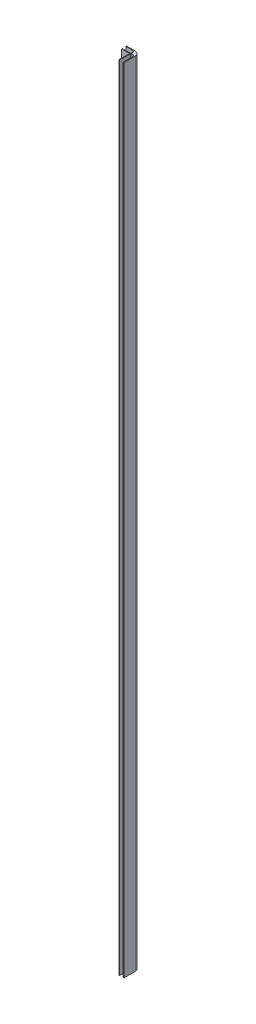
ISO-10303-21;
HEADER;
FILE_DESCRIPTION(('STEP AP214'),'2;1');
FILE_NAME('part.step','',(''),(''),'','','');
FILE_SCHEMA(('AUTOMOTIVE_DESIGN { 1 0 10303 214 1 1 1 1 }'));
ENDSEC;
DATA;
#1=APPLICATION_CONTEXT('core data for automotive mechanical design processes');
#2=APPLICATION_PROTOCOL_DEFINITION('international standard','automotive_design',2000,#1);
#3=PRODUCT_CONTEXT('',#1,'mechanical');
#4=PRODUCT('Part','Part','',(#3));
#5=PRODUCT_RELATED_PRODUCT_CATEGORY('part','',(#4));
#6=PRODUCT_DEFINITION_FORMATION('','',#4);
#7=PRODUCT_DEFINITION_CONTEXT('part definition',#1,'design');
#8=PRODUCT_DEFINITION('design','',#6,#7);
#9=PRODUCT_DEFINITION_SHAPE('','',#8);
#10=(LENGTH_UNIT() NAMED_UNIT(*) SI_UNIT(.MILLI.,.METRE.));
#11=(NAMED_UNIT(*) PLANE_ANGLE_UNIT() SI_UNIT($,.RADIAN.));
#12=(NAMED_UNIT(*) SI_UNIT($,.STERADIAN.) SOLID_ANGLE_UNIT());
#13=UNCERTAINTY_MEASURE_WITH_UNIT(LENGTH_MEASURE(1.E-05),#10,'distance_accuracy_value','');
#14=(GEOMETRIC_REPRESENTATION_CONTEXT(3) GLOBAL_UNCERTAINTY_ASSIGNED_CONTEXT((#13)) GLOBAL_UNIT_ASSIGNED_CONTEXT((#10,
#11,#12)) REPRESENTATION_CONTEXT('',''));
#15=CARTESIAN_POINT('',(0.,0.,0.));
#16=DIRECTION('',(0.,0.,1.));
#17=DIRECTION('',(1.,0.,0.));
#18=AXIS2_PLACEMENT_3D('',#15,#16,#17);
#19=CARTESIAN_POINT('',(5.33700608410615,1200.,-12.0504333475295));
#20=DIRECTION('',(0.,-1.,0.));
#21=DIRECTION('',(0.,0.,-1.));
#22=AXIS2_PLACEMENT_3D('',#19,#20,#21);
#23=CYLINDRICAL_SURFACE('',#22,6.5);
#24=CARTESIAN_POINT('',(5.33700608410615,0.,-12.0504333475295));
#25=DIRECTION('',(0.,1.,0.));
#26=DIRECTION('',(0.,0.,1.));
#27=AXIS2_PLACEMENT_3D('',#24,#25,#26);
#28=CIRCLE('',#27,6.5);
#29=CARTESIAN_POINT('',(11.8370060841062,0.,-12.0504333475295));
#30=VERTEX_POINT('',#29);
#31=CARTESIAN_POINT('',(5.33700608410615,0.,-18.5504333475295));
#32=VERTEX_POINT('',#31);
#33=EDGE_CURVE('E183',#30,#32,#28,.T.);
#34=ORIENTED_EDGE('',*,*,#33,.T.);
#35=DIRECTION('',(0.,-1.,0.));
#36=VECTOR('',#35,1.);
#37=CARTESIAN_POINT('',(5.33700608410615,1200.,-18.5504333475295));
#38=LINE('',#37,#36);
#39=CARTESIAN_POINT('',(5.33700608410615,1200.,-18.5504333475295));
#40=VERTEX_POINT('',#39);
#41=EDGE_CURVE('E164',#40,#32,#38,.T.);
#42=ORIENTED_EDGE('',*,*,#41,.F.);
#43=CARTESIAN_POINT('',(5.33700608410615,1200.,-12.0504333475295));
#44=DIRECTION('',(0.,1.,0.));
#45=DIRECTION('',(0.,0.,1.));
#46=AXIS2_PLACEMENT_3D('',#43,#44,#45);
#47=CIRCLE('',#46,6.5);
#48=CARTESIAN_POINT('',(11.8370060841062,1200.,-12.0504333475295));
#49=VERTEX_POINT('',#48);
#50=EDGE_CURVE('E171',#49,#40,#47,.T.);
#51=ORIENTED_EDGE('',*,*,#50,.F.);
#52=DIRECTION('',(0.,-1.,0.));
#53=VECTOR('',#52,1.);
#54=CARTESIAN_POINT('',(11.8370060841062,1200.,-12.0504333475295));
#55=LINE('',#54,#53);
#56=EDGE_CURVE('E266',#49,#30,#55,.T.);
#57=ORIENTED_EDGE('',*,*,#56,.T.);
#58=EDGE_LOOP('',(#34,#42,#51,#57));
#59=FACE_BOUND('',#58,.T.);
#60=ADVANCED_FACE('F35',(#59),#23,.T.);
#61=CARTESIAN_POINT('',(5.33700608410615,1200.,-18.5504333475295));
#62=DIRECTION('',(0.,0.,1.));
#63=DIRECTION('',(1.,0.,0.));
#64=AXIS2_PLACEMENT_3D('',#61,#62,#63);
#65=PLANE('',#64);
#66=DIRECTION('',(-1.,0.,0.));
#67=VECTOR('',#66,1.);
#68=CARTESIAN_POINT('',(5.33700608410615,0.,-18.5504333475295));
#69=LINE('',#68,#67);
#70=CARTESIAN_POINT('',(-7.8511249428798,0.,-18.5504333475295));
#71=VERTEX_POINT('',#70);
#72=EDGE_CURVE('E295',#32,#71,#69,.T.);
#73=ORIENTED_EDGE('',*,*,#72,.T.);
#74=DIRECTION('',(0.,-1.,0.));
#75=VECTOR('',#74,1.);
#76=CARTESIAN_POINT('',(-7.8511249428798,1200.,-18.5504333475295));
#77=LINE('',#76,#75);
#78=CARTESIAN_POINT('',(-7.8511249428798,1200.,-18.5504333475295));
#79=VERTEX_POINT('',#78);
#80=EDGE_CURVE('E167',#79,#71,#77,.T.);
#81=ORIENTED_EDGE('',*,*,#80,.F.);
#82=DIRECTION('',(-1.,0.,0.));
#83=VECTOR('',#82,1.);
#84=CARTESIAN_POINT('',(5.33700608410615,1200.,-18.5504333475295));
#85=LINE('',#84,#83);
#86=EDGE_CURVE('E160',#40,#79,#85,.T.);
#87=ORIENTED_EDGE('',*,*,#86,.F.);
#88=ORIENTED_EDGE('',*,*,#41,.T.);
#89=EDGE_LOOP('',(#73,#81,#87,#88));
#90=FACE_BOUND('',#89,.T.);
#91=ADVANCED_FACE('F162',(#90),#65,.F.);
#92=CARTESIAN_POINT('',(-7.8511249428798,1200.,-18.5504333475295));
#93=DIRECTION('',(1.,0.,0.));
#94=DIRECTION('',(0.,0.,-1.));
#95=AXIS2_PLACEMENT_3D('',#92,#93,#94);
#96=PLANE('',#95);
#97=DIRECTION('',(0.,0.,1.));
#98=VECTOR('',#97,1.);
#99=CARTESIAN_POINT('',(-7.8511249428798,0.,-18.5504333475295));
#100=LINE('',#99,#98);
#101=CARTESIAN_POINT('',(-7.8511249428798,0.,-17.5504333475295));
#102=VERTEX_POINT('',#101);
#103=EDGE_CURVE('E245',#71,#102,#100,.T.);
#104=ORIENTED_EDGE('',*,*,#103,.T.);
#105=DIRECTION('',(0.,-1.,0.));
#106=VECTOR('',#105,1.);
#107=CARTESIAN_POINT('',(-7.8511249428798,1200.,-17.5504333475295));
#108=LINE('',#107,#106);
#109=CARTESIAN_POINT('',(-7.8511249428798,1200.,-17.5504333475295));
#110=VERTEX_POINT('',#109);
#111=EDGE_CURVE('E189',#110,#102,#108,.T.);
#112=ORIENTED_EDGE('',*,*,#111,.F.);
#113=DIRECTION('',(0.,0.,1.));
#114=VECTOR('',#113,1.);
#115=CARTESIAN_POINT('',(-7.8511249428798,1200.,-18.5504333475295));
#116=LINE('',#115,#114);
#117=EDGE_CURVE('E170',#79,#110,#116,.T.);
#118=ORIENTED_EDGE('',*,*,#117,.F.);
#119=ORIENTED_EDGE('',*,*,#80,.T.);
#120=EDGE_LOOP('',(#104,#112,#118,#119));
#121=FACE_BOUND('',#120,.T.);
#122=ADVANCED_FACE('F318',(#121),#96,.F.);
#123=CARTESIAN_POINT('',(2.33700608410615,1200.,-17.5504333475295));
#124=DIRECTION('',(0.,0.,-1.));
#125=DIRECTION('',(-1.,0.,0.));
#126=AXIS2_PLACEMENT_3D('',#123,#124,#125);
#127=PLANE('',#126);
#128=DIRECTION('',(1.,0.,0.));
#129=VECTOR('',#128,1.);
#130=CARTESIAN_POINT('',(2.33700608410615,0.,-17.5504333475295));
#131=LINE('',#130,#129);
#132=CARTESIAN_POINT('',(2.33700608410615,0.,-17.5504333475295));
#133=VERTEX_POINT('',#132);
#134=EDGE_CURVE('E241',#102,#133,#131,.T.);
#135=ORIENTED_EDGE('',*,*,#134,.T.);
#136=DIRECTION('',(0.,-1.,0.));
#137=VECTOR('',#136,1.);
#138=CARTESIAN_POINT('',(2.33700608410615,1200.,-17.5504333475295));
#139=LINE('',#138,#137);
#140=CARTESIAN_POINT('',(2.33700608410615,1200.,-17.5504333475295));
#141=VERTEX_POINT('',#140);
#142=EDGE_CURVE('E240',#141,#133,#139,.T.);
#143=ORIENTED_EDGE('',*,*,#142,.F.);
#144=DIRECTION('',(1.,0.,0.));
#145=VECTOR('',#144,1.);
#146=CARTESIAN_POINT('',(2.33700608410615,1200.,-17.5504333475295));
#147=LINE('',#146,#145);
#148=EDGE_CURVE('E292',#110,#141,#147,.T.);
#149=ORIENTED_EDGE('',*,*,#148,.F.);
#150=ORIENTED_EDGE('',*,*,#111,.T.);
#151=EDGE_LOOP('',(#135,#143,#149,#150));
#152=FACE_BOUND('',#151,.T.);
#153=ADVANCED_FACE('F291',(#152),#127,.F.);
#154=CARTESIAN_POINT('',(2.33700608410615,1200.,-14.3004333475295));
#155=DIRECTION('',(0.,-1.,0.));
#156=DIRECTION('',(0.,0.,-1.));
#157=AXIS2_PLACEMENT_3D('',#154,#155,#156);
#158=CYLINDRICAL_SURFACE('',#157,3.25);
#159=CARTESIAN_POINT('',(2.33700608410615,0.,-14.3004333475295));
#160=DIRECTION('',(0.,-1.,0.));
#161=DIRECTION('',(0.,0.,1.));
#162=AXIS2_PLACEMENT_3D('',#159,#160,#161);
#163=CIRCLE('',#162,3.25);
#164=CARTESIAN_POINT('',(5.03931419677622,0.,-12.494877791974));
#165=VERTEX_POINT('',#164);
#166=EDGE_CURVE('E233',#133,#165,#163,.T.);
#167=ORIENTED_EDGE('',*,*,#166,.T.);
#168=DIRECTION('',(0.,-1.,0.));
#169=VECTOR('',#168,1.);
#170=CARTESIAN_POINT('',(5.03931419677622,1200.,-12.494877791974));
#171=LINE('',#170,#169);
#172=CARTESIAN_POINT('',(5.03931419677622,1200.,-12.494877791974));
#173=VERTEX_POINT('',#172);
#174=EDGE_CURVE('E197',#165,#173,#171,.F.);
#175=ORIENTED_EDGE('',*,*,#174,.T.);
#176=CARTESIAN_POINT('',(2.33700608410615,1200.,-14.3004333475295));
#177=DIRECTION('',(0.,-1.,0.));
#178=DIRECTION('',(0.,0.,1.));
#179=AXIS2_PLACEMENT_3D('',#176,#177,#178);
#180=CIRCLE('',#179,3.25);
#181=EDGE_CURVE('E216',#141,#173,#180,.T.);
#182=ORIENTED_EDGE('',*,*,#181,.F.);
#183=ORIENTED_EDGE('',*,*,#142,.T.);
#184=EDGE_LOOP('',(#167,#175,#182,#183));
#185=FACE_BOUND('',#184,.T.);
#186=ADVANCED_FACE('F238',(#185),#158,.F.);
#187=CARTESIAN_POINT('',(-7.8511249428798,1200.,-12.0504333475295));
#188=DIRECTION('',(0.,0.,1.));
#189=DIRECTION('',(1.,0.,0.));
#190=AXIS2_PLACEMENT_3D('',#187,#188,#189);
#191=PLANE('',#190);
#192=DIRECTION('',(-1.,0.,0.));
#193=VECTOR('',#192,1.);
#194=CARTESIAN_POINT('',(-7.8511249428798,1200.,-12.0504333475295));
#195=LINE('',#194,#193);
#196=CARTESIAN_POINT('',(4.20783477749313,1200.,-12.0504333475295));
#197=VERTEX_POINT('',#196);
#198=CARTESIAN_POINT('',(-7.8511249428798,1200.,-12.0504333475295));
#199=VERTEX_POINT('',#198);
#200=EDGE_CURVE('E213',#197,#199,#195,.T.);
#201=ORIENTED_EDGE('',*,*,#200,.F.);
#202=DIRECTION('',(0.,1.,0.));
#203=VECTOR('',#202,1.);
#204=CARTESIAN_POINT('',(4.20783477749313,0.,-12.0504333475295));
#205=LINE('',#204,#203);
#206=CARTESIAN_POINT('',(4.20783477749313,0.,-12.0504333475295));
#207=VERTEX_POINT('',#206);
#208=EDGE_CURVE('E194',#197,#207,#205,.F.);
#209=ORIENTED_EDGE('',*,*,#208,.T.);
#210=DIRECTION('',(-1.,0.,0.));
#211=VECTOR('',#210,1.);
#212=CARTESIAN_POINT('',(-7.8511249428798,0.,-12.0504333475295));
#213=LINE('',#212,#211);
#214=CARTESIAN_POINT('',(-7.8511249428798,0.,-12.0504333475295));
#215=VERTEX_POINT('',#214);
#216=EDGE_CURVE('E235',#207,#215,#213,.T.);
#217=ORIENTED_EDGE('',*,*,#216,.T.);
#218=DIRECTION('',(0.,-1.,0.));
#219=VECTOR('',#218,1.);
#220=CARTESIAN_POINT('',(-7.8511249428798,1200.,-12.0504333475295));
#221=LINE('',#220,#219);
#222=EDGE_CURVE('E224',#199,#215,#221,.T.);
#223=ORIENTED_EDGE('',*,*,#222,.F.);
#224=EDGE_LOOP('',(#201,#209,#217,#223));
#225=FACE_BOUND('',#224,.T.);
#226=ADVANCED_FACE('F221',(#225),#191,.F.);
#227=CARTESIAN_POINT('',(-7.8511249428798,1200.,-12.0504333475295));
#228=DIRECTION('',(1.,0.,0.));
#229=DIRECTION('',(0.,0.,-1.));
#230=AXIS2_PLACEMENT_3D('',#227,#228,#229);
#231=PLANE('',#230);
#232=DIRECTION('',(0.,0.,1.));
#233=VECTOR('',#232,1.);
#234=CARTESIAN_POINT('',(-7.8511249428798,0.,-12.0504333475295));
#235=LINE('',#234,#233);
#236=CARTESIAN_POINT('',(-7.8511249428798,0.,-11.0504333475295));
#237=VERTEX_POINT('',#236);
#238=EDGE_CURVE('E243',#215,#237,#235,.T.);
#239=ORIENTED_EDGE('',*,*,#238,.T.);
#240=DIRECTION('',(0.,-1.,0.));
#241=VECTOR('',#240,1.);
#242=CARTESIAN_POINT('',(-7.8511249428798,1200.,-11.0504333475295));
#243=LINE('',#242,#241);
#244=CARTESIAN_POINT('',(-7.8511249428798,1200.,-11.0504333475295));
#245=VERTEX_POINT('',#244);
#246=EDGE_CURVE('E283',#245,#237,#243,.T.);
#247=ORIENTED_EDGE('',*,*,#246,.F.);
#248=DIRECTION('',(0.,0.,1.));
#249=VECTOR('',#248,1.);
#250=CARTESIAN_POINT('',(-7.8511249428798,1200.,-12.0504333475295));
#251=LINE('',#250,#249);
#252=EDGE_CURVE('E226',#199,#245,#251,.T.);
#253=ORIENTED_EDGE('',*,*,#252,.F.);
#254=ORIENTED_EDGE('',*,*,#222,.T.);
#255=EDGE_LOOP('',(#239,#247,#253,#254));
#256=FACE_BOUND('',#255,.T.);
#257=ADVANCED_FACE('F389',(#256),#231,.F.);
#258=CARTESIAN_POINT('',(-7.8511249428798,1200.,-11.0504333475295));
#259=DIRECTION('',(0.,0.,-1.));
#260=DIRECTION('',(-1.,0.,0.));
#261=AXIS2_PLACEMENT_3D('',#258,#259,#260);
#262=PLANE('',#261);
#263=DIRECTION('',(1.,0.,0.));
#264=VECTOR('',#263,1.);
#265=CARTESIAN_POINT('',(-7.8511249428798,0.,-11.0504333475295));
#266=LINE('',#265,#264);
#267=CARTESIAN_POINT('',(3.33700608410615,0.,-11.0504333475295));
#268=VERTEX_POINT('',#267);
#269=EDGE_CURVE('E250',#237,#268,#266,.T.);
#270=ORIENTED_EDGE('',*,*,#269,.T.);
#271=DIRECTION('',(0.,-1.,0.));
#272=VECTOR('',#271,1.);
#273=CARTESIAN_POINT('',(3.33700608410615,1200.,-11.0504333475295));
#274=LINE('',#273,#272);
#275=CARTESIAN_POINT('',(3.33700608410615,1200.,-11.0504333475295));
#276=VERTEX_POINT('',#275);
#277=EDGE_CURVE('E187',#268,#276,#274,.F.);
#278=ORIENTED_EDGE('',*,*,#277,.T.);
#279=DIRECTION('',(1.,0.,0.));
#280=VECTOR('',#279,1.);
#281=CARTESIAN_POINT('',(-7.8511249428798,1200.,-11.0504333475295));
#282=LINE('',#281,#280);
#283=EDGE_CURVE('E312',#245,#276,#282,.T.);
#284=ORIENTED_EDGE('',*,*,#283,.F.);
#285=ORIENTED_EDGE('',*,*,#246,.T.);
#286=EDGE_LOOP('',(#270,#278,#284,#285));
#287=FACE_BOUND('',#286,.T.);
#288=ADVANCED_FACE('F385',(#287),#262,.F.);
#289=CARTESIAN_POINT('',(4.33700608410615,1200.,-11.0504333475295));
#290=DIRECTION('',(1.,0.,0.));
#291=DIRECTION('',(0.,0.,-1.));
#292=AXIS2_PLACEMENT_3D('',#289,#290,#291);
#293=PLANE('',#292);
#294=DIRECTION('',(0.,0.,1.));
#295=VECTOR('',#294,1.);
#296=CARTESIAN_POINT('',(4.33700608410615,1200.,-11.0504333475295));
#297=LINE('',#296,#295);
#298=CARTESIAN_POINT('',(4.33700608410615,1200.,-10.0504333475295));
#299=VERTEX_POINT('',#298);
#300=CARTESIAN_POINT('',(4.33700608410616,1200.,5.16889475011333));
#301=VERTEX_POINT('',#300);
#302=EDGE_CURVE('E310',#299,#301,#297,.T.);
#303=ORIENTED_EDGE('',*,*,#302,.F.);
#304=DIRECTION('',(0.,-1.,0.));
#305=VECTOR('',#304,1.);
#306=CARTESIAN_POINT('',(4.33700608410615,0.,-10.0504333475295));
#307=LINE('',#306,#305);
#308=CARTESIAN_POINT('',(4.33700608410615,0.,-10.0504333475295));
#309=VERTEX_POINT('',#308);
#310=EDGE_CURVE('E184',#299,#309,#307,.T.);
#311=ORIENTED_EDGE('',*,*,#310,.T.);
#312=DIRECTION('',(0.,0.,1.));
#313=VECTOR('',#312,1.);
#314=CARTESIAN_POINT('',(4.33700608410615,0.,-11.0504333475295));
#315=LINE('',#314,#313);
#316=CARTESIAN_POINT('',(4.33700608410616,0.,5.16889475011333));
#317=VERTEX_POINT('',#316);
#318=EDGE_CURVE('E253',#309,#317,#315,.T.);
#319=ORIENTED_EDGE('',*,*,#318,.T.);
#320=DIRECTION('',(0.,-1.,0.));
#321=VECTOR('',#320,1.);
#322=CARTESIAN_POINT('',(4.33700608410616,1200.,5.16889475011333));
#323=LINE('',#322,#321);
#324=EDGE_CURVE('E280',#301,#317,#323,.T.);
#325=ORIENTED_EDGE('',*,*,#324,.F.);
#326=EDGE_LOOP('',(#303,#311,#319,#325));
#327=FACE_BOUND('',#326,.T.);
#328=ADVANCED_FACE('F381',(#327),#293,.F.);
#329=CARTESIAN_POINT('',(4.33700608410616,1200.,5.16889475011333));
#330=DIRECTION('',(0.,0.,-1.));
#331=DIRECTION('',(-1.,0.,0.));
#332=AXIS2_PLACEMENT_3D('',#329,#330,#331);
#333=PLANE('',#332);
#334=DIRECTION('',(1.,0.,0.));
#335=VECTOR('',#334,1.);
#336=CARTESIAN_POINT('',(4.33700608410616,0.,5.16889475011333));
#337=LINE('',#336,#335);
#338=CARTESIAN_POINT('',(5.33700608410616,0.,5.16889475011333));
#339=VERTEX_POINT('',#338);
#340=EDGE_CURVE('E255',#317,#339,#337,.T.);
#341=ORIENTED_EDGE('',*,*,#340,.T.);
#342=DIRECTION('',(0.,-1.,0.));
#343=VECTOR('',#342,1.);
#344=CARTESIAN_POINT('',(5.33700608410616,1200.,5.16889475011333));
#345=LINE('',#344,#343);
#346=CARTESIAN_POINT('',(5.33700608410616,1200.,5.16889475011333));
#347=VERTEX_POINT('',#346);
#348=EDGE_CURVE('E277',#347,#339,#345,.T.);
#349=ORIENTED_EDGE('',*,*,#348,.F.);
#350=DIRECTION('',(1.,0.,0.));
#351=VECTOR('',#350,1.);
#352=CARTESIAN_POINT('',(4.33700608410616,1200.,5.16889475011333));
#353=LINE('',#352,#351);
#354=EDGE_CURVE('E308',#301,#347,#353,.T.);
#355=ORIENTED_EDGE('',*,*,#354,.F.);
#356=ORIENTED_EDGE('',*,*,#324,.T.);
#357=EDGE_LOOP('',(#341,#349,#355,#356));
#358=FACE_BOUND('',#357,.T.);
#359=ADVANCED_FACE('F378',(#358),#333,.F.);
#360=CARTESIAN_POINT('',(5.33700608410615,1200.,-11.3956412274413));
#361=DIRECTION('',(-1.,0.,0.));
#362=DIRECTION('',(0.,0.,1.));
#363=AXIS2_PLACEMENT_3D('',#360,#361,#362);
#364=PLANE('',#363);
#365=DIRECTION('',(0.,0.,-1.));
#366=VECTOR('',#365,1.);
#367=CARTESIAN_POINT('',(5.33700608410615,0.,-11.3956412274413));
#368=LINE('',#367,#366);
#369=CARTESIAN_POINT('',(5.33700608410615,0.,-10.9212620409165));
#370=VERTEX_POINT('',#369);
#371=EDGE_CURVE('E257',#339,#370,#368,.T.);
#372=ORIENTED_EDGE('',*,*,#371,.T.);
#373=DIRECTION('',(0.,1.,0.));
#374=VECTOR('',#373,1.);
#375=CARTESIAN_POINT('',(5.33700608410615,1200.,-10.9212620409165));
#376=LINE('',#375,#374);
#377=CARTESIAN_POINT('',(5.33700608410615,1200.,-10.9212620409165));
#378=VERTEX_POINT('',#377);
#379=EDGE_CURVE('E50',#370,#378,#376,.T.);
#380=ORIENTED_EDGE('',*,*,#379,.T.);
#381=DIRECTION('',(0.,0.,-1.));
#382=VECTOR('',#381,1.);
#383=CARTESIAN_POINT('',(5.33700608410615,1200.,-11.3956412274413));
#384=LINE('',#383,#382);
#385=EDGE_CURVE('E306',#347,#378,#384,.T.);
#386=ORIENTED_EDGE('',*,*,#385,.F.);
#387=ORIENTED_EDGE('',*,*,#348,.T.);
#388=EDGE_LOOP('',(#372,#380,#386,#387));
#389=FACE_BOUND('',#388,.T.);
#390=ADVANCED_FACE('F375',(#389),#364,.F.);
#391=CARTESIAN_POINT('',(7.58700608410615,1200.,-9.05043334752954));
#392=DIRECTION('',(0.,-1.,0.));
#393=DIRECTION('',(0.,0.,-1.));
#394=AXIS2_PLACEMENT_3D('',#391,#392,#393);
#395=CYLINDRICAL_SURFACE('',#394,3.25);
#396=CARTESIAN_POINT('',(7.58700608410615,1200.,-9.05043334752954));
#397=DIRECTION('',(0.,-1.,0.));
#398=DIRECTION('',(0.,0.,1.));
#399=AXIS2_PLACEMENT_3D('',#396,#397,#398);
#400=CIRCLE('',#399,3.25);
#401=CARTESIAN_POINT('',(5.7814505285506,1200.,-11.7527414601996));
#402=VERTEX_POINT('',#401);
#403=CARTESIAN_POINT('',(10.8370060841062,1200.,-9.05043334752954));
#404=VERTEX_POINT('',#403);
#405=EDGE_CURVE('E304',#402,#404,#400,.T.);
#406=ORIENTED_EDGE('',*,*,#405,.F.);
#407=DIRECTION('',(0.,-1.,0.));
#408=VECTOR('',#407,1.);
#409=CARTESIAN_POINT('',(5.7814505285506,1200.,-11.7527414601996));
#410=LINE('',#409,#408);
#411=CARTESIAN_POINT('',(5.7814505285506,0.,-11.7527414601996));
#412=VERTEX_POINT('',#411);
#413=EDGE_CURVE('E199',#402,#412,#410,.T.);
#414=ORIENTED_EDGE('',*,*,#413,.T.);
#415=CARTESIAN_POINT('',(7.58700608410615,0.,-9.05043334752954));
#416=DIRECTION('',(0.,-1.,0.));
#417=DIRECTION('',(0.,0.,1.));
#418=AXIS2_PLACEMENT_3D('',#415,#416,#417);
#419=CIRCLE('',#418,3.25);
#420=CARTESIAN_POINT('',(10.8370060841062,0.,-9.05043334752954));
#421=VERTEX_POINT('',#420);
#422=EDGE_CURVE('E259',#412,#421,#419,.T.);
#423=ORIENTED_EDGE('',*,*,#422,.T.);
#424=DIRECTION('',(0.,-1.,0.));
#425=VECTOR('',#424,1.);
#426=CARTESIAN_POINT('',(10.8370060841062,1200.,-9.05043334752954));
#427=LINE('',#426,#425);
#428=EDGE_CURVE('E274',#404,#421,#427,.T.);
#429=ORIENTED_EDGE('',*,*,#428,.F.);
#430=EDGE_LOOP('',(#406,#414,#423,#429));
#431=FACE_BOUND('',#430,.T.);
#432=ADVANCED_FACE('F347',(#431),#395,.F.);
#433=CARTESIAN_POINT('',(10.8370060841062,1200.,-9.05043334752954));
#434=DIRECTION('',(1.,0.,0.));
#435=DIRECTION('',(0.,0.,-1.));
#436=AXIS2_PLACEMENT_3D('',#433,#434,#435);
#437=PLANE('',#436);
#438=DIRECTION('',(0.,0.,1.));
#439=VECTOR('',#438,1.);
#440=CARTESIAN_POINT('',(10.8370060841062,0.,-9.05043334752954));
#441=LINE('',#440,#439);
#442=CARTESIAN_POINT('',(10.8370060841062,0.,5.16889475011333));
#443=VERTEX_POINT('',#442);
#444=EDGE_CURVE('E261',#421,#443,#441,.T.);
#445=ORIENTED_EDGE('',*,*,#444,.T.);
#446=DIRECTION('',(0.,-1.,0.));
#447=VECTOR('',#446,1.);
#448=CARTESIAN_POINT('',(10.8370060841062,1200.,5.16889475011333));
#449=LINE('',#448,#447);
#450=CARTESIAN_POINT('',(10.8370060841062,1200.,5.16889475011333));
#451=VERTEX_POINT('',#450);
#452=EDGE_CURVE('E271',#451,#443,#449,.T.);
#453=ORIENTED_EDGE('',*,*,#452,.F.);
#454=DIRECTION('',(0.,0.,1.));
#455=VECTOR('',#454,1.);
#456=CARTESIAN_POINT('',(10.8370060841062,1200.,-9.05043334752954));
#457=LINE('',#456,#455);
#458=EDGE_CURVE('E302',#404,#451,#457,.T.);
#459=ORIENTED_EDGE('',*,*,#458,.F.);
#460=ORIENTED_EDGE('',*,*,#428,.T.);
#461=EDGE_LOOP('',(#445,#453,#459,#460));
#462=FACE_BOUND('',#461,.T.);
#463=ADVANCED_FACE('F352',(#462),#437,.F.);
#464=CARTESIAN_POINT('',(10.8370060841062,1200.,5.16889475011333));
#465=DIRECTION('',(0.,0.,-1.));
#466=DIRECTION('',(-1.,0.,0.));
#467=AXIS2_PLACEMENT_3D('',#464,#465,#466);
#468=PLANE('',#467);
#469=DIRECTION('',(1.,0.,0.));
#470=VECTOR('',#469,1.);
#471=CARTESIAN_POINT('',(10.8370060841062,0.,5.16889475011333));
#472=LINE('',#471,#470);
#473=CARTESIAN_POINT('',(11.8370060841062,0.,5.16889475011333));
#474=VERTEX_POINT('',#473);
#475=EDGE_CURVE('E263',#443,#474,#472,.T.);
#476=ORIENTED_EDGE('',*,*,#475,.T.);
#477=DIRECTION('',(0.,-1.,0.));
#478=VECTOR('',#477,1.);
#479=CARTESIAN_POINT('',(11.8370060841062,1200.,5.16889475011333));
#480=LINE('',#479,#478);
#481=CARTESIAN_POINT('',(11.8370060841062,1200.,5.16889475011333));
#482=VERTEX_POINT('',#481);
#483=EDGE_CURVE('E268',#482,#474,#480,.T.);
#484=ORIENTED_EDGE('',*,*,#483,.F.);
#485=DIRECTION('',(1.,0.,0.));
#486=VECTOR('',#485,1.);
#487=CARTESIAN_POINT('',(10.8370060841062,1200.,5.16889475011333));
#488=LINE('',#487,#486);
#489=EDGE_CURVE('E300',#451,#482,#488,.T.);
#490=ORIENTED_EDGE('',*,*,#489,.F.);
#491=ORIENTED_EDGE('',*,*,#452,.T.);
#492=EDGE_LOOP('',(#476,#484,#490,#491));
#493=FACE_BOUND('',#492,.T.);
#494=ADVANCED_FACE('F356',(#493),#468,.F.);
#495=CARTESIAN_POINT('',(11.8370060841062,1200.,-12.0504333475295));
#496=DIRECTION('',(-1.,0.,0.));
#497=DIRECTION('',(0.,0.,1.));
#498=AXIS2_PLACEMENT_3D('',#495,#496,#497);
#499=PLANE('',#498);
#500=DIRECTION('',(0.,0.,-1.));
#501=VECTOR('',#500,1.);
#502=CARTESIAN_POINT('',(11.8370060841062,0.,-12.0504333475295));
#503=LINE('',#502,#501);
#504=EDGE_CURVE('E180',#474,#30,#503,.T.);
#505=ORIENTED_EDGE('',*,*,#504,.T.);
#506=ORIENTED_EDGE('',*,*,#56,.F.);
#507=DIRECTION('',(0.,0.,-1.));
#508=VECTOR('',#507,1.);
#509=CARTESIAN_POINT('',(11.8370060841062,1200.,-12.0504333475295));
#510=LINE('',#509,#508);
#511=EDGE_CURVE('E176',#482,#49,#510,.T.);
#512=ORIENTED_EDGE('',*,*,#511,.F.);
#513=ORIENTED_EDGE('',*,*,#483,.T.);
#514=EDGE_LOOP('',(#505,#506,#512,#513));
#515=FACE_BOUND('',#514,.T.);
#516=ADVANCED_FACE('F360',(#515),#499,.F.);
#517=CARTESIAN_POINT('',(5.33700608410615,1200.,-12.0504333475295));
#518=DIRECTION('',(0.,1.,0.));
#519=DIRECTION('',(0.,0.,1.));
#520=AXIS2_PLACEMENT_3D('',#517,#518,#519);
#521=PLANE('',#520);
#522=ORIENTED_EDGE('',*,*,#50,.T.);
#523=ORIENTED_EDGE('',*,*,#86,.T.);
#524=ORIENTED_EDGE('',*,*,#117,.T.);
#525=ORIENTED_EDGE('',*,*,#148,.T.);
#526=ORIENTED_EDGE('',*,*,#181,.T.);
#527=CARTESIAN_POINT('',(4.20783477749313,1200.,-13.0504333475295));
#528=DIRECTION('',(0.,1.,0.));
#529=DIRECTION('',(0.,0.,1.));
#530=AXIS2_PLACEMENT_3D('',#527,#528,#529);
#531=CIRCLE('',#530,1.);
#532=EDGE_CURVE('E209',#173,#197,#531,.F.);
#533=ORIENTED_EDGE('',*,*,#532,.T.);
#534=ORIENTED_EDGE('',*,*,#200,.T.);
#535=ORIENTED_EDGE('',*,*,#252,.T.);
#536=ORIENTED_EDGE('',*,*,#283,.T.);
#537=CARTESIAN_POINT('',(3.33700608410615,1200.,-10.0504333475295));
#538=DIRECTION('',(0.,1.,0.));
#539=DIRECTION('',(0.,0.,1.));
#540=AXIS2_PLACEMENT_3D('',#537,#538,#539);
#541=CIRCLE('',#540,1.);
#542=EDGE_CURVE('E205',#276,#299,#541,.F.);
#543=ORIENTED_EDGE('',*,*,#542,.T.);
#544=ORIENTED_EDGE('',*,*,#302,.T.);
#545=ORIENTED_EDGE('',*,*,#354,.T.);
#546=ORIENTED_EDGE('',*,*,#385,.T.);
#547=CARTESIAN_POINT('',(6.33700608410615,1200.,-10.9212620409165));
#548=DIRECTION('',(0.,1.,0.));
#549=DIRECTION('',(0.,0.,1.));
#550=AXIS2_PLACEMENT_3D('',#547,#548,#549);
#551=CIRCLE('',#550,1.);
#552=EDGE_CURVE('E12',#378,#402,#551,.F.);
#553=ORIENTED_EDGE('',*,*,#552,.T.);
#554=ORIENTED_EDGE('',*,*,#405,.T.);
#555=ORIENTED_EDGE('',*,*,#458,.T.);
#556=ORIENTED_EDGE('',*,*,#489,.T.);
#557=ORIENTED_EDGE('',*,*,#511,.T.);
#558=EDGE_LOOP('',(#522,#523,#524,#525,#526,#533,#534,#535,#536,#543,#544,#545,#546,#553,#554,
#555,#556,#557));
#559=FACE_BOUND('',#558,.T.);
#560=ADVANCED_FACE('F174',(#559),#521,.T.);
#561=CARTESIAN_POINT('',(5.33700608410615,0.,-12.0504333475295));
#562=DIRECTION('',(0.,1.,0.));
#563=DIRECTION('',(0.,0.,1.));
#564=AXIS2_PLACEMENT_3D('',#561,#562,#563);
#565=PLANE('',#564);
#566=ORIENTED_EDGE('',*,*,#33,.F.);
#567=ORIENTED_EDGE('',*,*,#504,.F.);
#568=ORIENTED_EDGE('',*,*,#475,.F.);
#569=ORIENTED_EDGE('',*,*,#444,.F.);
#570=ORIENTED_EDGE('',*,*,#422,.F.);
#571=CARTESIAN_POINT('',(6.33700608410615,0.,-10.9212620409165));
#572=DIRECTION('',(0.,1.,0.));
#573=DIRECTION('',(0.,0.,1.));
#574=AXIS2_PLACEMENT_3D('',#571,#572,#573);
#575=CIRCLE('',#574,1.);
#576=EDGE_CURVE('E43',#412,#370,#575,.T.);
#577=ORIENTED_EDGE('',*,*,#576,.T.);
#578=ORIENTED_EDGE('',*,*,#371,.F.);
#579=ORIENTED_EDGE('',*,*,#340,.F.);
#580=ORIENTED_EDGE('',*,*,#318,.F.);
#581=CARTESIAN_POINT('',(3.33700608410615,0.,-10.0504333475295));
#582=DIRECTION('',(0.,1.,0.));
#583=DIRECTION('',(0.,0.,1.));
#584=AXIS2_PLACEMENT_3D('',#581,#582,#583);
#585=CIRCLE('',#584,1.);
#586=EDGE_CURVE('E203',#309,#268,#585,.T.);
#587=ORIENTED_EDGE('',*,*,#586,.T.);
#588=ORIENTED_EDGE('',*,*,#269,.F.);
#589=ORIENTED_EDGE('',*,*,#238,.F.);
#590=ORIENTED_EDGE('',*,*,#216,.F.);
#591=CARTESIAN_POINT('',(4.20783477749313,0.,-13.0504333475295));
#592=DIRECTION('',(0.,1.,0.));
#593=DIRECTION('',(0.,0.,1.));
#594=AXIS2_PLACEMENT_3D('',#591,#592,#593);
#595=CIRCLE('',#594,1.);
#596=EDGE_CURVE('E207',#207,#165,#595,.T.);
#597=ORIENTED_EDGE('',*,*,#596,.T.);
#598=ORIENTED_EDGE('',*,*,#166,.F.);
#599=ORIENTED_EDGE('',*,*,#134,.F.);
#600=ORIENTED_EDGE('',*,*,#103,.F.);
#601=ORIENTED_EDGE('',*,*,#72,.F.);
#602=EDGE_LOOP('',(#566,#567,#568,#569,#570,#577,#578,#579,#580,#587,#588,#589,#590,#597,#598,
#599,#600,#601));
#603=FACE_BOUND('',#602,.T.);
#604=ADVANCED_FACE('F231',(#603),#565,.F.);
#605=CARTESIAN_POINT('',(3.33700608410615,1200.,-10.0504333475295));
#606=DIRECTION('',(0.,1.,0.));
#607=DIRECTION('',(0.,0.,1.));
#608=AXIS2_PLACEMENT_3D('',#605,#606,#607);
#609=CYLINDRICAL_SURFACE('',#608,1.);
#610=ORIENTED_EDGE('',*,*,#542,.F.);
#611=ORIENTED_EDGE('',*,*,#277,.F.);
#612=ORIENTED_EDGE('',*,*,#586,.F.);
#613=ORIENTED_EDGE('',*,*,#310,.F.);
#614=EDGE_LOOP('',(#610,#611,#612,#613));
#615=FACE_BOUND('',#614,.T.);
#616=ADVANCED_FACE('F332',(#615),#609,.F.);
#617=CARTESIAN_POINT('',(4.20783477749313,1200.,-13.0504333475295));
#618=DIRECTION('',(0.,-1.,0.));
#619=DIRECTION('',(0.,0.,-1.));
#620=AXIS2_PLACEMENT_3D('',#617,#618,#619);
#621=CYLINDRICAL_SURFACE('',#620,1.);
#622=ORIENTED_EDGE('',*,*,#532,.F.);
#623=ORIENTED_EDGE('',*,*,#174,.F.);
#624=ORIENTED_EDGE('',*,*,#596,.F.);
#625=ORIENTED_EDGE('',*,*,#208,.F.);
#626=EDGE_LOOP('',(#622,#623,#624,#625));
#627=FACE_BOUND('',#626,.T.);
#628=ADVANCED_FACE('F228',(#627),#621,.F.);
#629=CARTESIAN_POINT('',(6.33700608410615,1200.,-10.9212620409165));
#630=DIRECTION('',(0.,-1.,0.));
#631=DIRECTION('',(0.,0.,-1.));
#632=AXIS2_PLACEMENT_3D('',#629,#630,#631);
#633=CYLINDRICAL_SURFACE('',#632,1.);
#634=ORIENTED_EDGE('',*,*,#552,.F.);
#635=ORIENTED_EDGE('',*,*,#379,.F.);
#636=ORIENTED_EDGE('',*,*,#576,.F.);
#637=ORIENTED_EDGE('',*,*,#413,.F.);
#638=EDGE_LOOP('',(#634,#635,#636,#637));
#639=FACE_BOUND('',#638,.T.);
#640=ADVANCED_FACE('F37',(#639),#633,.F.);
#641=CLOSED_SHELL('',(#60,#91,#122,#153,#186,#226,#257,#288,#328,#359,#390,#432,#463,#494,#516,
#560,#604,#616,#628,#640));
#642=MANIFOLD_SOLID_BREP('B2',#641);
#643=ADVANCED_BREP_SHAPE_REPRESENTATION('',(#18,#642),#14);
#644=SHAPE_DEFINITION_REPRESENTATION(#9,#643);
ENDSEC;
END-ISO-10303-21;
